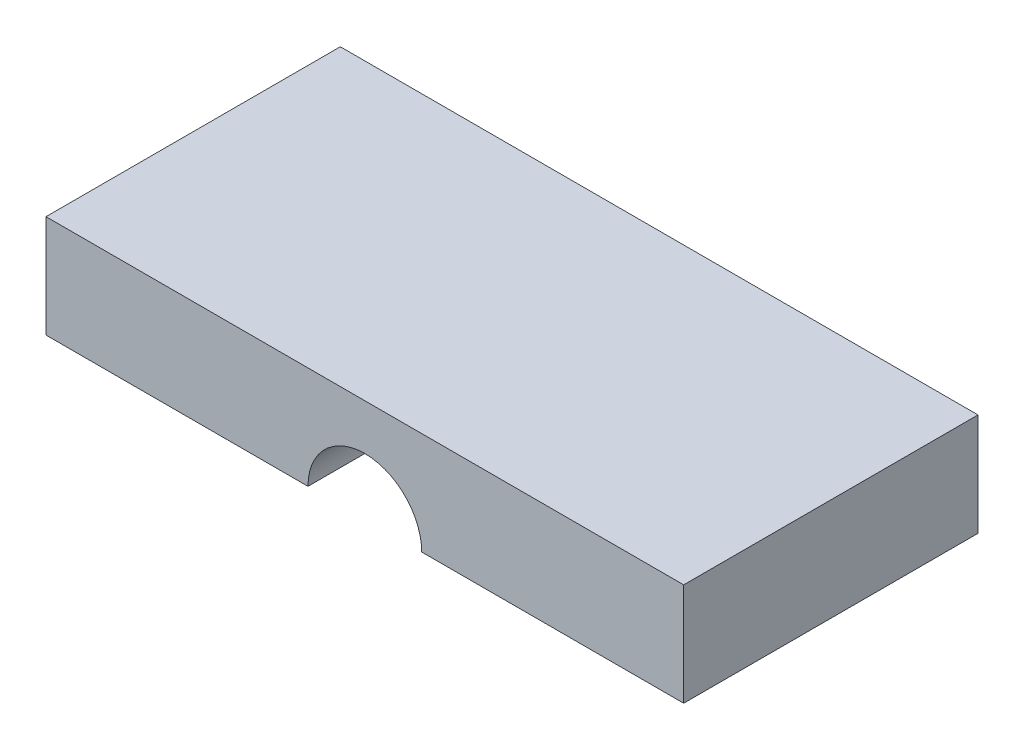
ISO-10303-21;
HEADER;
FILE_DESCRIPTION(('STEP AP214'),'2;1');
FILE_NAME('part.step','',(''),(''),'','','');
FILE_SCHEMA(('AUTOMOTIVE_DESIGN { 1 0 10303 214 1 1 1 1 }'));
ENDSEC;
DATA;
#1=APPLICATION_CONTEXT('core data for automotive mechanical design processes');
#2=APPLICATION_PROTOCOL_DEFINITION('international standard','automotive_design',2000,#1);
#3=PRODUCT_CONTEXT('',#1,'mechanical');
#4=PRODUCT('Part','Part','',(#3));
#5=PRODUCT_RELATED_PRODUCT_CATEGORY('part','',(#4));
#6=PRODUCT_DEFINITION_FORMATION('','',#4);
#7=PRODUCT_DEFINITION_CONTEXT('part definition',#1,'design');
#8=PRODUCT_DEFINITION('design','',#6,#7);
#9=PRODUCT_DEFINITION_SHAPE('','',#8);
#10=(LENGTH_UNIT() NAMED_UNIT(*) SI_UNIT(.MILLI.,.METRE.));
#11=(NAMED_UNIT(*) PLANE_ANGLE_UNIT() SI_UNIT($,.RADIAN.));
#12=(NAMED_UNIT(*) SI_UNIT($,.STERADIAN.) SOLID_ANGLE_UNIT());
#13=UNCERTAINTY_MEASURE_WITH_UNIT(LENGTH_MEASURE(1.E-05),#10,'distance_accuracy_value','');
#14=(GEOMETRIC_REPRESENTATION_CONTEXT(3) GLOBAL_UNCERTAINTY_ASSIGNED_CONTEXT((#13)) GLOBAL_UNIT_ASSIGNED_CONTEXT((#10,
#11,#12)) REPRESENTATION_CONTEXT('',''));
#15=CARTESIAN_POINT('',(0.,0.,0.));
#16=DIRECTION('',(0.,0.,1.));
#17=DIRECTION('',(1.,0.,0.));
#18=AXIS2_PLACEMENT_3D('',#15,#16,#17);
#19=CARTESIAN_POINT('',(0.,-4.6,7.));
#20=DIRECTION('',(0.,0.,-1.));
#21=DIRECTION('',(-1.,0.,0.));
#22=AXIS2_PLACEMENT_3D('',#19,#20,#21);
#23=CYLINDRICAL_SURFACE('',#22,2.55);
#24=DIRECTION('',(0.,0.,1.));
#25=VECTOR('',#24,1.);
#26=CARTESIAN_POINT('',(-2.55000000000001,-4.6,0.));
#27=LINE('',#26,#25);
#28=CARTESIAN_POINT('',(-2.55000000000001,-4.6,-7.));
#29=VERTEX_POINT('',#28);
#30=CARTESIAN_POINT('',(-2.55000000000001,-4.6,6.2));
#31=VERTEX_POINT('',#30);
#32=EDGE_CURVE('E67',#29,#31,#27,.T.);
#33=ORIENTED_EDGE('',*,*,#32,.F.);
#34=CARTESIAN_POINT('',(0.,-4.6,-7.));
#35=DIRECTION('',(0.,0.,-1.));
#36=DIRECTION('',(-1.,0.,0.));
#37=AXIS2_PLACEMENT_3D('',#34,#35,#36);
#38=CIRCLE('',#37,2.55);
#39=CARTESIAN_POINT('',(2.54999999999999,-4.6,-7.));
#40=VERTEX_POINT('',#39);
#41=EDGE_CURVE('E84',#40,#29,#38,.F.);
#42=ORIENTED_EDGE('',*,*,#41,.F.);
#43=DIRECTION('',(0.,0.,1.));
#44=VECTOR('',#43,1.);
#45=CARTESIAN_POINT('',(2.54999999999999,-4.6,0.));
#46=LINE('',#45,#44);
#47=CARTESIAN_POINT('',(2.54999999999999,-4.6,6.2));
#48=VERTEX_POINT('',#47);
#49=EDGE_CURVE('E83',#48,#40,#46,.F.);
#50=ORIENTED_EDGE('',*,*,#49,.F.);
#51=CARTESIAN_POINT('',(0.,-4.6,6.2));
#52=DIRECTION('',(0.,0.,-1.));
#53=DIRECTION('',(-1.,0.,0.));
#54=AXIS2_PLACEMENT_3D('',#51,#52,#53);
#55=CIRCLE('',#54,2.55);
#56=EDGE_CURVE('E19',#31,#48,#55,.T.);
#57=ORIENTED_EDGE('',*,*,#56,.F.);
#58=EDGE_LOOP('',(#33,#42,#50,#57));
#59=FACE_BOUND('',#58,.T.);
#60=ADVANCED_FACE('F16',(#59),#23,.F.);
#61=CARTESIAN_POINT('',(0.,-4.6,0.));
#62=DIRECTION('',(0.,-1.,0.));
#63=DIRECTION('',(1.,0.,0.));
#64=AXIS2_PLACEMENT_3D('',#61,#62,#63);
#65=PLANE('',#64);
#66=DIRECTION('',(0.,0.,1.));
#67=VECTOR('',#66,1.);
#68=CARTESIAN_POINT('',(-14.3,-4.6,6.2));
#69=LINE('',#68,#67);
#70=CARTESIAN_POINT('',(-14.3,-4.6,-7.));
#71=VERTEX_POINT('',#70);
#72=CARTESIAN_POINT('',(-14.3,-4.6,6.2));
#73=VERTEX_POINT('',#72);
#74=EDGE_CURVE('E128',#71,#73,#69,.T.);
#75=ORIENTED_EDGE('',*,*,#74,.F.);
#76=DIRECTION('',(-1.,0.,0.));
#77=VECTOR('',#76,1.);
#78=CARTESIAN_POINT('',(-14.3,-4.6,-7.));
#79=LINE('',#78,#77);
#80=EDGE_CURVE('E135',#29,#71,#79,.T.);
#81=ORIENTED_EDGE('',*,*,#80,.F.);
#82=ORIENTED_EDGE('',*,*,#32,.T.);
#83=DIRECTION('',(1.,0.,0.));
#84=VECTOR('',#83,1.);
#85=CARTESIAN_POINT('',(14.3,-4.6,6.2));
#86=LINE('',#85,#84);
#87=EDGE_CURVE('E78',#73,#31,#86,.T.);
#88=ORIENTED_EDGE('',*,*,#87,.F.);
#89=EDGE_LOOP('',(#75,#81,#82,#88));
#90=FACE_BOUND('',#89,.T.);
#91=ADVANCED_FACE('F171',(#90),#65,.T.);
#92=CARTESIAN_POINT('',(0.,-4.6,0.));
#93=DIRECTION('',(0.,-1.,0.));
#94=DIRECTION('',(1.,0.,0.));
#95=AXIS2_PLACEMENT_3D('',#92,#93,#94);
#96=PLANE('',#95);
#97=DIRECTION('',(0.,0.,-1.));
#98=VECTOR('',#97,1.);
#99=CARTESIAN_POINT('',(14.3,-4.6,-7.));
#100=LINE('',#99,#98);
#101=CARTESIAN_POINT('',(14.3,-4.6,6.2));
#102=VERTEX_POINT('',#101);
#103=CARTESIAN_POINT('',(14.3,-4.6,-7.));
#104=VERTEX_POINT('',#103);
#105=EDGE_CURVE('E81',#102,#104,#100,.T.);
#106=ORIENTED_EDGE('',*,*,#105,.F.);
#107=DIRECTION('',(1.,0.,0.));
#108=VECTOR('',#107,1.);
#109=CARTESIAN_POINT('',(14.3,-4.6,6.2));
#110=LINE('',#109,#108);
#111=EDGE_CURVE('E76',#48,#102,#110,.T.);
#112=ORIENTED_EDGE('',*,*,#111,.F.);
#113=ORIENTED_EDGE('',*,*,#49,.T.);
#114=DIRECTION('',(-1.,0.,0.));
#115=VECTOR('',#114,1.);
#116=CARTESIAN_POINT('',(-14.3,-4.6,-7.));
#117=LINE('',#116,#115);
#118=EDGE_CURVE('E110',#104,#40,#117,.T.);
#119=ORIENTED_EDGE('',*,*,#118,.F.);
#120=EDGE_LOOP('',(#106,#112,#113,#119));
#121=FACE_BOUND('',#120,.T.);
#122=ADVANCED_FACE('F90',(#121),#96,.T.);
#123=CARTESIAN_POINT('',(14.3,0.,-7.));
#124=DIRECTION('',(1.,0.,0.));
#125=DIRECTION('',(0.,0.,-1.));
#126=AXIS2_PLACEMENT_3D('',#123,#124,#125);
#127=PLANE('',#126);
#128=ORIENTED_EDGE('',*,*,#105,.T.);
#129=DIRECTION('',(0.,1.,0.));
#130=VECTOR('',#129,1.);
#131=CARTESIAN_POINT('',(14.3,0.,-7.));
#132=LINE('',#131,#130);
#133=CARTESIAN_POINT('',(14.3,0.,-7.));
#134=VERTEX_POINT('',#133);
#135=EDGE_CURVE('E106',#134,#104,#132,.F.);
#136=ORIENTED_EDGE('',*,*,#135,.F.);
#137=DIRECTION('',(0.,0.,1.));
#138=VECTOR('',#137,1.);
#139=CARTESIAN_POINT('',(14.3,0.,0.));
#140=LINE('',#139,#138);
#141=CARTESIAN_POINT('',(14.3,0.,6.2));
#142=VERTEX_POINT('',#141);
#143=EDGE_CURVE('E117',#134,#142,#140,.T.);
#144=ORIENTED_EDGE('',*,*,#143,.T.);
#145=DIRECTION('',(0.,1.,0.));
#146=VECTOR('',#145,1.);
#147=CARTESIAN_POINT('',(14.3,0.,6.2));
#148=LINE('',#147,#146);
#149=EDGE_CURVE('E93',#102,#142,#148,.T.);
#150=ORIENTED_EDGE('',*,*,#149,.F.);
#151=EDGE_LOOP('',(#128,#136,#144,#150));
#152=FACE_BOUND('',#151,.T.);
#153=ADVANCED_FACE('F165',(#152),#127,.T.);
#154=CARTESIAN_POINT('',(14.3,0.,6.2));
#155=DIRECTION('',(0.,0.,1.));
#156=DIRECTION('',(1.,0.,0.));
#157=AXIS2_PLACEMENT_3D('',#154,#155,#156);
#158=PLANE('',#157);
#159=DIRECTION('',(0.,1.,0.));
#160=VECTOR('',#159,1.);
#161=CARTESIAN_POINT('',(-14.3,0.,6.2));
#162=LINE('',#161,#160);
#163=CARTESIAN_POINT('',(-14.3,0.,6.2));
#164=VERTEX_POINT('',#163);
#165=EDGE_CURVE('E131',#73,#164,#162,.T.);
#166=ORIENTED_EDGE('',*,*,#165,.F.);
#167=ORIENTED_EDGE('',*,*,#87,.T.);
#168=ORIENTED_EDGE('',*,*,#56,.T.);
#169=ORIENTED_EDGE('',*,*,#111,.T.);
#170=ORIENTED_EDGE('',*,*,#149,.T.);
#171=DIRECTION('',(1.,0.,0.));
#172=VECTOR('',#171,1.);
#173=CARTESIAN_POINT('',(0.,0.,6.2));
#174=LINE('',#173,#172);
#175=EDGE_CURVE('E121',#142,#164,#174,.F.);
#176=ORIENTED_EDGE('',*,*,#175,.T.);
#177=EDGE_LOOP('',(#166,#167,#168,#169,#170,#176));
#178=FACE_BOUND('',#177,.T.);
#179=ADVANCED_FACE('F74',(#178),#158,.T.);
#180=CARTESIAN_POINT('',(-14.3,0.,6.2));
#181=DIRECTION('',(-1.,0.,0.));
#182=DIRECTION('',(0.,0.,1.));
#183=AXIS2_PLACEMENT_3D('',#180,#181,#182);
#184=PLANE('',#183);
#185=ORIENTED_EDGE('',*,*,#74,.T.);
#186=ORIENTED_EDGE('',*,*,#165,.T.);
#187=DIRECTION('',(0.,0.,1.));
#188=VECTOR('',#187,1.);
#189=CARTESIAN_POINT('',(-14.3,0.,0.));
#190=LINE('',#189,#188);
#191=CARTESIAN_POINT('',(-14.3,0.,-7.));
#192=VERTEX_POINT('',#191);
#193=EDGE_CURVE('E26',#164,#192,#190,.F.);
#194=ORIENTED_EDGE('',*,*,#193,.T.);
#195=DIRECTION('',(0.,1.,0.));
#196=VECTOR('',#195,1.);
#197=CARTESIAN_POINT('',(-14.3,0.,-7.));
#198=LINE('',#197,#196);
#199=EDGE_CURVE('E34',#71,#192,#198,.T.);
#200=ORIENTED_EDGE('',*,*,#199,.F.);
#201=EDGE_LOOP('',(#185,#186,#194,#200));
#202=FACE_BOUND('',#201,.T.);
#203=ADVANCED_FACE('F170',(#202),#184,.T.);
#204=CARTESIAN_POINT('',(-14.3,0.,-7.));
#205=DIRECTION('',(0.,0.,-1.));
#206=DIRECTION('',(-1.,0.,0.));
#207=AXIS2_PLACEMENT_3D('',#204,#205,#206);
#208=PLANE('',#207);
#209=ORIENTED_EDGE('',*,*,#135,.T.);
#210=ORIENTED_EDGE('',*,*,#118,.T.);
#211=ORIENTED_EDGE('',*,*,#41,.T.);
#212=ORIENTED_EDGE('',*,*,#80,.T.);
#213=ORIENTED_EDGE('',*,*,#199,.T.);
#214=DIRECTION('',(1.,0.,0.));
#215=VECTOR('',#214,1.);
#216=CARTESIAN_POINT('',(0.,0.,-7.));
#217=LINE('',#216,#215);
#218=EDGE_CURVE('E11',#192,#134,#217,.T.);
#219=ORIENTED_EDGE('',*,*,#218,.T.);
#220=EDGE_LOOP('',(#209,#210,#211,#212,#213,#219));
#221=FACE_BOUND('',#220,.T.);
#222=ADVANCED_FACE('F162',(#221),#208,.T.);
#223=CARTESIAN_POINT('',(0.,0.,0.));
#224=DIRECTION('',(0.,-1.,0.));
#225=DIRECTION('',(1.,0.,0.));
#226=AXIS2_PLACEMENT_3D('',#223,#224,#225);
#227=PLANE('',#226);
#228=ORIENTED_EDGE('',*,*,#193,.F.);
#229=ORIENTED_EDGE('',*,*,#175,.F.);
#230=ORIENTED_EDGE('',*,*,#143,.F.);
#231=ORIENTED_EDGE('',*,*,#218,.F.);
#232=EDGE_LOOP('',(#228,#229,#230,#231));
#233=FACE_BOUND('',#232,.T.);
#234=ADVANCED_FACE('F168',(#233),#227,.F.);
#235=CLOSED_SHELL('',(#60,#91,#122,#153,#179,#203,#222,#234));
#236=MANIFOLD_SOLID_BREP('B1',#235);
#237=ADVANCED_BREP_SHAPE_REPRESENTATION('',(#18,#236),#14);
#238=SHAPE_DEFINITION_REPRESENTATION(#9,#237);
ENDSEC;
END-ISO-10303-21;
